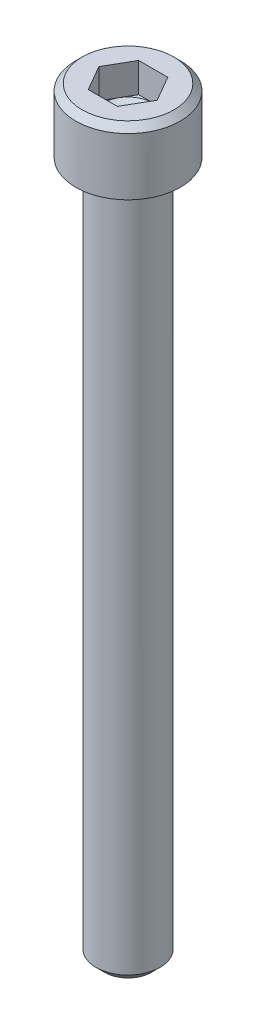
ISO-10303-21;
HEADER;
FILE_DESCRIPTION(('STEP AP214'),'2;1');
FILE_NAME('part.step','',(''),(''),'','','');
FILE_SCHEMA(('AUTOMOTIVE_DESIGN { 1 0 10303 214 1 1 1 1 }'));
ENDSEC;
DATA;
#1=APPLICATION_CONTEXT('core data for automotive mechanical design processes');
#2=APPLICATION_PROTOCOL_DEFINITION('international standard','automotive_design',2000,#1);
#3=PRODUCT_CONTEXT('',#1,'mechanical');
#4=PRODUCT('Part','Part','',(#3));
#5=PRODUCT_RELATED_PRODUCT_CATEGORY('part','',(#4));
#6=PRODUCT_DEFINITION_FORMATION('','',#4);
#7=PRODUCT_DEFINITION_CONTEXT('part definition',#1,'design');
#8=PRODUCT_DEFINITION('design','',#6,#7);
#9=PRODUCT_DEFINITION_SHAPE('','',#8);
#10=(LENGTH_UNIT() NAMED_UNIT(*) SI_UNIT(.MILLI.,.METRE.));
#11=(NAMED_UNIT(*) PLANE_ANGLE_UNIT() SI_UNIT($,.RADIAN.));
#12=(NAMED_UNIT(*) SI_UNIT($,.STERADIAN.) SOLID_ANGLE_UNIT());
#13=UNCERTAINTY_MEASURE_WITH_UNIT(LENGTH_MEASURE(1.E-05),#10,'distance_accuracy_value','');
#14=(GEOMETRIC_REPRESENTATION_CONTEXT(3) GLOBAL_UNCERTAINTY_ASSIGNED_CONTEXT((#13)) GLOBAL_UNIT_ASSIGNED_CONTEXT((#10,
#11,#12)) REPRESENTATION_CONTEXT('',''));
#15=CARTESIAN_POINT('',(0.,0.,0.));
#16=DIRECTION('',(0.,0.,1.));
#17=DIRECTION('',(1.,0.,0.));
#18=AXIS2_PLACEMENT_3D('',#15,#16,#17);
#19=CARTESIAN_POINT('',(0.,1.8796,0.));
#20=DIRECTION('',(0.,1.,0.));
#21=DIRECTION('',(0.,0.,1.));
#22=AXIS2_PLACEMENT_3D('',#19,#20,#21);
#23=PLANE('',#22);
#24=DIRECTION('',(-1.,0.,0.));
#25=VECTOR('',#24,1.);
#26=CARTESIAN_POINT('',(0.799225977638982,1.8796,-1.38429999999987));
#27=LINE('',#26,#25);
#28=CARTESIAN_POINT('',(0.799225977638982,1.8796,-1.38429999999987));
#29=VERTEX_POINT('',#28);
#30=CARTESIAN_POINT('',(0.,1.87959999999497,-1.38429999999987));
#31=VERTEX_POINT('',#30);
#32=EDGE_CURVE('E160',#29,#31,#27,.T.);
#33=ORIENTED_EDGE('',*,*,#32,.T.);
#34=CARTESIAN_POINT('',(0.,1.87959999999497,0.));
#35=DIRECTION('',(0.,-1.,0.));
#36=DIRECTION('',(0.,0.,-1.));
#37=AXIS2_PLACEMENT_3D('',#34,#35,#36);
#38=CIRCLE('',#37,1.38430000004078);
#39=CARTESIAN_POINT('',(1.19883896649411,1.87959999999497,-0.692150000020388));
#40=VERTEX_POINT('',#39);
#41=EDGE_CURVE('E48',#31,#40,#38,.T.);
#42=ORIENTED_EDGE('',*,*,#41,.T.);
#43=DIRECTION('',(-0.5,0.,-0.866025403784439));
#44=VECTOR('',#43,1.);
#45=CARTESIAN_POINT('',(1.59845195527816,1.8796,0.));
#46=LINE('',#45,#44);
#47=EDGE_CURVE('E287',#40,#29,#46,.T.);
#48=ORIENTED_EDGE('',*,*,#47,.T.);
#49=EDGE_LOOP('',(#33,#42,#48));
#50=FACE_BOUND('',#49,.T.);
#51=ADVANCED_FACE('F33',(#50),#23,.T.);
#52=CARTESIAN_POINT('',(1.59845195527816,1.8796,0.));
#53=VERTEX_POINT('',#52);
#54=EDGE_CURVE('E288',#53,#40,#46,.T.);
#55=ORIENTED_EDGE('',*,*,#54,.T.);
#56=CARTESIAN_POINT('',(1.19883896649411,1.87959999999497,0.692150000020388));
#57=VERTEX_POINT('',#56);
#58=EDGE_CURVE('E201',#40,#57,#38,.T.);
#59=ORIENTED_EDGE('',*,*,#58,.T.);
#60=DIRECTION('',(0.5,0.,-0.866025403784439));
#61=VECTOR('',#60,1.);
#62=CARTESIAN_POINT('',(0.799225977639064,1.8796,1.38429999999992));
#63=LINE('',#62,#61);
#64=EDGE_CURVE('E284',#57,#53,#63,.T.);
#65=ORIENTED_EDGE('',*,*,#64,.T.);
#66=EDGE_LOOP('',(#55,#59,#65));
#67=FACE_BOUND('',#66,.T.);
#68=ADVANCED_FACE('F123',(#67),#23,.T.);
#69=CARTESIAN_POINT('',(0.799225977639064,1.8796,1.38429999999992));
#70=VERTEX_POINT('',#69);
#71=EDGE_CURVE('E274',#70,#57,#63,.T.);
#72=ORIENTED_EDGE('',*,*,#71,.T.);
#73=CARTESIAN_POINT('',(0.,1.87959999999497,1.38430000004078));
#74=VERTEX_POINT('',#73);
#75=EDGE_CURVE('E296',#57,#74,#38,.T.);
#76=ORIENTED_EDGE('',*,*,#75,.T.);
#77=DIRECTION('',(1.,0.,0.));
#78=VECTOR('',#77,1.);
#79=CARTESIAN_POINT('',(-0.799225977639255,1.8796,1.38429999999992));
#80=LINE('',#79,#78);
#81=EDGE_CURVE('E182',#74,#70,#80,.T.);
#82=ORIENTED_EDGE('',*,*,#81,.T.);
#83=EDGE_LOOP('',(#72,#76,#82));
#84=FACE_BOUND('',#83,.T.);
#85=ADVANCED_FACE('F129',(#84),#23,.T.);
#86=CARTESIAN_POINT('',(-0.799225977639255,1.8796,1.38429999999992));
#87=VERTEX_POINT('',#86);
#88=EDGE_CURVE('E277',#87,#74,#80,.T.);
#89=ORIENTED_EDGE('',*,*,#88,.T.);
#90=CARTESIAN_POINT('',(-1.19883896649414,1.87959999999497,0.692150000020335));
#91=VERTEX_POINT('',#90);
#92=EDGE_CURVE('E283',#74,#91,#38,.T.);
#93=ORIENTED_EDGE('',*,*,#92,.T.);
#94=DIRECTION('',(0.499999999999962,0.,0.866025403784461));
#95=VECTOR('',#94,1.);
#96=CARTESIAN_POINT('',(-1.59845195527835,1.8796,0.));
#97=LINE('',#96,#95);
#98=EDGE_CURVE('E155',#91,#87,#97,.T.);
#99=ORIENTED_EDGE('',*,*,#98,.T.);
#100=EDGE_LOOP('',(#89,#93,#99));
#101=FACE_BOUND('',#100,.T.);
#102=ADVANCED_FACE('F144',(#101),#23,.T.);
#103=CARTESIAN_POINT('',(-1.59845195527835,1.8796,0.));
#104=VERTEX_POINT('',#103);
#105=EDGE_CURVE('E158',#104,#91,#97,.T.);
#106=ORIENTED_EDGE('',*,*,#105,.T.);
#107=CARTESIAN_POINT('',(-1.19883896649411,1.87959999999497,-0.692150000020388));
#108=VERTEX_POINT('',#107);
#109=EDGE_CURVE('E295',#91,#108,#38,.T.);
#110=ORIENTED_EDGE('',*,*,#109,.T.);
#111=DIRECTION('',(-0.5,0.,0.866025403784439));
#112=VECTOR('',#111,1.);
#113=CARTESIAN_POINT('',(-0.799225977639255,1.8796,-1.38429999999987));
#114=LINE('',#113,#112);
#115=EDGE_CURVE('E156',#108,#104,#114,.T.);
#116=ORIENTED_EDGE('',*,*,#115,.T.);
#117=EDGE_LOOP('',(#106,#110,#116));
#118=FACE_BOUND('',#117,.T.);
#119=ADVANCED_FACE('F135',(#118),#23,.T.);
#120=CARTESIAN_POINT('',(-0.799225977639255,1.8796,-1.38429999999987));
#121=VERTEX_POINT('',#120);
#122=EDGE_CURVE('E148',#121,#108,#114,.T.);
#123=ORIENTED_EDGE('',*,*,#122,.T.);
#124=EDGE_CURVE('E149',#108,#31,#38,.T.);
#125=ORIENTED_EDGE('',*,*,#124,.T.);
#126=EDGE_CURVE('E151',#31,#121,#27,.T.);
#127=ORIENTED_EDGE('',*,*,#126,.T.);
#128=EDGE_LOOP('',(#123,#125,#127));
#129=FACE_BOUND('',#128,.T.);
#130=ADVANCED_FACE('F125',(#129),#23,.T.);
#131=CARTESIAN_POINT('',(0.,0.,0.));
#132=DIRECTION('',(0.,-1.,0.));
#133=DIRECTION('',(0.,0.,-1.));
#134=AXIS2_PLACEMENT_3D('',#131,#132,#133);
#135=PLANE('',#134);
#136=CARTESIAN_POINT('',(0.,0.,0.));
#137=DIRECTION('',(0.,-1.,0.));
#138=DIRECTION('',(0.,0.,-1.));
#139=AXIS2_PLACEMENT_3D('',#136,#137,#138);
#140=CIRCLE('',#139,2.0066);
#141=CARTESIAN_POINT('',(0.,0.,-2.0066));
#142=VERTEX_POINT('',#141);
#143=EDGE_CURVE('E11',#142,#142,#140,.F.);
#144=ORIENTED_EDGE('',*,*,#143,.T.);
#145=EDGE_LOOP('',(#144));
#146=FACE_BOUND('',#145,.T.);
#147=CARTESIAN_POINT('',(0.,0.,0.));
#148=DIRECTION('',(0.,-1.,0.));
#149=DIRECTION('',(0.,0.,-1.));
#150=AXIS2_PLACEMENT_3D('',#147,#148,#149);
#151=CIRCLE('',#150,2.8702);
#152=CARTESIAN_POINT('',(0.,0.,-2.8702));
#153=VERTEX_POINT('',#152);
#154=EDGE_CURVE('E185',#153,#153,#151,.T.);
#155=ORIENTED_EDGE('',*,*,#154,.T.);
#156=EDGE_LOOP('',(#155));
#157=FACE_BOUND('',#156,.T.);
#158=ADVANCED_FACE('F134',(#146,#157),#135,.T.);
#159=CARTESIAN_POINT('',(0.,3.5052,0.));
#160=DIRECTION('',(0.,-1.,0.));
#161=DIRECTION('',(0.,0.,-1.));
#162=AXIS2_PLACEMENT_3D('',#159,#160,#161);
#163=CYLINDRICAL_SURFACE('',#162,2.8702);
#164=CARTESIAN_POINT('',(0.,3.14960000004543,0.));
#165=DIRECTION('',(0.,1.,0.));
#166=DIRECTION('',(0.,0.,1.));
#167=AXIS2_PLACEMENT_3D('',#164,#165,#166);
#168=CIRCLE('',#167,2.8702);
#169=CARTESIAN_POINT('',(0.,3.14960000004543,2.8702));
#170=VERTEX_POINT('',#169);
#171=EDGE_CURVE('E204',#170,#170,#168,.F.);
#172=ORIENTED_EDGE('',*,*,#171,.T.);
#173=EDGE_LOOP('',(#172));
#174=FACE_BOUND('',#173,.T.);
#175=ORIENTED_EDGE('',*,*,#154,.F.);
#176=EDGE_LOOP('',(#175));
#177=FACE_BOUND('',#176,.T.);
#178=ADVANCED_FACE('F141',(#174,#177),#163,.T.);
#179=CARTESIAN_POINT('',(2.8702,3.5052,0.));
#180=DIRECTION('',(0.,1.,0.));
#181=DIRECTION('',(0.,0.,1.));
#182=AXIS2_PLACEMENT_3D('',#179,#180,#181);
#183=PLANE('',#182);
#184=CARTESIAN_POINT('',(0.,3.5052,0.));
#185=DIRECTION('',(0.,1.,0.));
#186=DIRECTION('',(0.,0.,1.));
#187=AXIS2_PLACEMENT_3D('',#184,#185,#186);
#188=CIRCLE('',#187,2.51459999998859);
#189=CARTESIAN_POINT('',(0.,3.5052,2.51459999998859));
#190=VERTEX_POINT('',#189);
#191=EDGE_CURVE('E207',#190,#190,#188,.T.);
#192=ORIENTED_EDGE('',*,*,#191,.T.);
#193=EDGE_LOOP('',(#192));
#194=FACE_BOUND('',#193,.T.);
#195=DIRECTION('',(1.,0.,0.));
#196=VECTOR('',#195,1.);
#197=CARTESIAN_POINT('',(-0.799225977639255,3.5052,1.38429999999992));
#198=LINE('',#197,#196);
#199=CARTESIAN_POINT('',(-0.799225977639255,3.5052,1.38429999999992));
#200=VERTEX_POINT('',#199);
#201=CARTESIAN_POINT('',(0.799225977639064,3.5052,1.38429999999992));
#202=VERTEX_POINT('',#201);
#203=EDGE_CURVE('E56',#200,#202,#198,.T.);
#204=ORIENTED_EDGE('',*,*,#203,.F.);
#205=DIRECTION('',(0.499999999999962,0.,0.866025403784461));
#206=VECTOR('',#205,1.);
#207=CARTESIAN_POINT('',(-1.59845195527835,3.5052,0.));
#208=LINE('',#207,#206);
#209=CARTESIAN_POINT('',(-1.59845195527835,3.5052,0.));
#210=VERTEX_POINT('',#209);
#211=EDGE_CURVE('E179',#210,#200,#208,.T.);
#212=ORIENTED_EDGE('',*,*,#211,.F.);
#213=DIRECTION('',(-0.5,0.,0.866025403784439));
#214=VECTOR('',#213,1.);
#215=CARTESIAN_POINT('',(-0.799225977639255,3.5052,-1.38429999999987));
#216=LINE('',#215,#214);
#217=CARTESIAN_POINT('',(-0.799225977639255,3.5052,-1.38429999999987));
#218=VERTEX_POINT('',#217);
#219=EDGE_CURVE('E176',#218,#210,#216,.T.);
#220=ORIENTED_EDGE('',*,*,#219,.F.);
#221=DIRECTION('',(-1.,0.,0.));
#222=VECTOR('',#221,1.);
#223=CARTESIAN_POINT('',(0.799225977638982,3.5052,-1.38429999999987));
#224=LINE('',#223,#222);
#225=CARTESIAN_POINT('',(0.799225977638982,3.5052,-1.38429999999987));
#226=VERTEX_POINT('',#225);
#227=EDGE_CURVE('E173',#226,#218,#224,.T.);
#228=ORIENTED_EDGE('',*,*,#227,.F.);
#229=DIRECTION('',(-0.5,0.,-0.866025403784439));
#230=VECTOR('',#229,1.);
#231=CARTESIAN_POINT('',(1.59845195527816,3.5052,0.));
#232=LINE('',#231,#230);
#233=CARTESIAN_POINT('',(1.59845195527816,3.5052,0.));
#234=VERTEX_POINT('',#233);
#235=EDGE_CURVE('E170',#234,#226,#232,.T.);
#236=ORIENTED_EDGE('',*,*,#235,.F.);
#237=DIRECTION('',(0.5,0.,-0.866025403784439));
#238=VECTOR('',#237,1.);
#239=CARTESIAN_POINT('',(0.799225977639064,3.5052,1.38429999999992));
#240=LINE('',#239,#238);
#241=EDGE_CURVE('E167',#202,#234,#240,.T.);
#242=ORIENTED_EDGE('',*,*,#241,.F.);
#243=EDGE_LOOP('',(#204,#212,#220,#228,#236,#242));
#244=FACE_BOUND('',#243,.T.);
#245=ADVANCED_FACE('F226',(#194,#244),#183,.T.);
#246=CARTESIAN_POINT('',(0.,-38.1,0.));
#247=DIRECTION('',(0.,1.,0.));
#248=DIRECTION('',(0.,0.,1.));
#249=AXIS2_PLACEMENT_3D('',#246,#247,#248);
#250=CYLINDRICAL_SURFACE('',#249,1.7526);
#251=CARTESIAN_POINT('',(0.,-0.253999999999997,0.));
#252=DIRECTION('',(0.,-1.,0.));
#253=DIRECTION('',(0.,0.,-1.));
#254=AXIS2_PLACEMENT_3D('',#251,#252,#253);
#255=CIRCLE('',#254,1.7526);
#256=CARTESIAN_POINT('',(0.,-0.25399999999999,1.7526));
#257=VERTEX_POINT('',#256);
#258=EDGE_CURVE('E41',#257,#257,#255,.T.);
#259=CARTESIAN_POINT('',(0.,-37.6275599999883,0.));
#260=DIRECTION('',(0.,-1.,0.));
#261=DIRECTION('',(0.,0.,-1.));
#262=AXIS2_PLACEMENT_3D('',#259,#260,#261);
#263=CIRCLE('',#262,1.7526);
#264=CARTESIAN_POINT('',(0.,-37.6275599999883,1.7526));
#265=VERTEX_POINT('',#264);
#266=EDGE_CURVE('E200',#265,#265,#263,.F.);
#267=CARTESIAN_POINT('',(0.,-0.25399999999999,1.7526));
#268=CARTESIAN_POINT('',(0.,-0.643307916666535,1.7526));
#269=CARTESIAN_POINT('',(0.,-1.03261583333308,1.7526));
#270=CARTESIAN_POINT('',(0.,-1.81123166666617,1.7526));
#271=CARTESIAN_POINT('',(0.,-2.20053958333271,1.7526));
#272=CARTESIAN_POINT('',(0.,-2.9791554166658,1.7526));
#273=CARTESIAN_POINT('',(0.,-3.36846333333235,1.7526));
#274=CARTESIAN_POINT('',(0.,-4.14707916666544,1.7526));
#275=CARTESIAN_POINT('',(0.,-4.53638708333199,1.7526));
#276=CARTESIAN_POINT('',(0.,-5.31500291666507,1.7526));
#277=CARTESIAN_POINT('',(0.,-5.70431083333162,1.7526));
#278=CARTESIAN_POINT('',(0.,-6.48292666666471,1.7526));
#279=CARTESIAN_POINT('',(0.,-6.87223458333125,1.7526));
#280=CARTESIAN_POINT('',(0.,-7.65085041666434,1.7526));
#281=CARTESIAN_POINT('',(0.,-8.04015833333089,1.7526));
#282=CARTESIAN_POINT('',(0.,-8.81877416666398,1.7526));
#283=CARTESIAN_POINT('',(0.,-9.20808208333052,1.7526));
#284=CARTESIAN_POINT('',(0.,-9.98669791666361,1.7526));
#285=CARTESIAN_POINT('',(0.,-10.3760058333302,1.7526));
#286=CARTESIAN_POINT('',(0.,-11.1546216666632,1.7526));
#287=CARTESIAN_POINT('',(0.,-11.5439295833298,1.7526));
#288=CARTESIAN_POINT('',(0.,-12.3225454166629,1.7526));
#289=CARTESIAN_POINT('',(0.,-12.7118533333294,1.7526));
#290=CARTESIAN_POINT('',(0.,-13.4904691666625,1.7526));
#291=CARTESIAN_POINT('',(0.,-13.8797770833291,1.7526));
#292=CARTESIAN_POINT('',(0.,-14.6583929166621,1.7526));
#293=CARTESIAN_POINT('',(0.,-15.0477008333287,1.7526));
#294=CARTESIAN_POINT('',(0.,-15.8263166666618,1.7526));
#295=CARTESIAN_POINT('',(0.,-16.2156245833283,1.7526));
#296=CARTESIAN_POINT('',(0.,-16.9942404166614,1.7526));
#297=CARTESIAN_POINT('',(0.,-17.383548333328,1.7526));
#298=CARTESIAN_POINT('',(0.,-18.1621641666611,1.7526));
#299=CARTESIAN_POINT('',(0.,-18.5514720833276,1.7526));
#300=CARTESIAN_POINT('',(0.,-19.3300879166607,1.7526));
#301=CARTESIAN_POINT('',(0.,-19.7193958333272,1.7526));
#302=CARTESIAN_POINT('',(0.,-20.4980116666603,1.7526));
#303=CARTESIAN_POINT('',(0.,-20.8873195833269,1.7526));
#304=CARTESIAN_POINT('',(0.,-21.66593541666,1.7526));
#305=CARTESIAN_POINT('',(0.,-22.0552433333265,1.7526));
#306=CARTESIAN_POINT('',(0.,-22.8338591666596,1.7526));
#307=CARTESIAN_POINT('',(0.,-23.2231670833261,1.7526));
#308=CARTESIAN_POINT('',(0.,-24.0017829166592,1.7526));
#309=CARTESIAN_POINT('',(0.,-24.3910908333258,1.7526));
#310=CARTESIAN_POINT('',(0.,-25.1697066666589,1.7526));
#311=CARTESIAN_POINT('',(0.,-25.5590145833254,1.7526));
#312=CARTESIAN_POINT('',(0.,-26.3376304166585,1.7526));
#313=CARTESIAN_POINT('',(0.,-26.726938333325,1.7526));
#314=CARTESIAN_POINT('',(0.,-27.5055541666581,1.7526));
#315=CARTESIAN_POINT('',(0.,-27.8948620833247,1.7526));
#316=CARTESIAN_POINT('',(0.,-28.6734779166578,1.7526));
#317=CARTESIAN_POINT('',(0.,-29.0627858333243,1.7526));
#318=CARTESIAN_POINT('',(0.,-29.8414016666574,1.7526));
#319=CARTESIAN_POINT('',(0.,-30.2307095833239,1.7526));
#320=CARTESIAN_POINT('',(0.,-31.009325416657,1.7526));
#321=CARTESIAN_POINT('',(0.,-31.3986333333236,1.7526));
#322=CARTESIAN_POINT('',(0.,-32.1772491666567,1.7526));
#323=CARTESIAN_POINT('',(0.,-32.5665570833232,1.7526));
#324=CARTESIAN_POINT('',(0.,-33.3451729166563,1.7526));
#325=CARTESIAN_POINT('',(0.,-33.7344808333228,1.7526));
#326=CARTESIAN_POINT('',(0.,-34.5130966666559,1.7526));
#327=CARTESIAN_POINT('',(0.,-34.9024045833225,1.7526));
#328=CARTESIAN_POINT('',(0.,-35.6810204166556,1.7526));
#329=CARTESIAN_POINT('',(0.,-36.0703283333221,1.7526));
#330=CARTESIAN_POINT('',(0.,-36.8489441666552,1.7526));
#331=CARTESIAN_POINT('',(0.,-37.2382520833218,1.7526));
#332=CARTESIAN_POINT('',(0.,-37.6275599999883,1.7526));
#333=B_SPLINE_CURVE_WITH_KNOTS('',3,(#267,#268,#269,#270,#271,#272,#273,#274,#275,#276,#277,
#278,#279,#280,#281,#282,#283,#284,#285,#286,#287,#288,#289,#290,#291,#292,#293,#294,#295,#296,
#297,#298,#299,#300,#301,#302,#303,#304,#305,#306,#307,#308,#309,#310,#311,#312,#313,#314,#315,
#316,#317,#318,#319,#320,#321,#322,#323,#324,#325,#326,#327,#328,#329,#330,#331,#332),
.UNSPECIFIED.,.F.,.F.,(4,2,2,2,2,2,2,2,2,2,2,2,2,2,2,2,2,2,2,2,2,2,2,2,2,2,2,2,2,2,2,2,4),(0.,
1.16792374999963,2.33584749999927,3.50377124999891,4.67169499999854,5.83961874999817,
7.00754249999781,8.17546624999744,9.34338999999708,10.5113137499967,11.6792374999963,
12.847161249996,14.0150849999956,15.1830087499952,16.3509324999949,17.5188562499945,
18.6867799999942,19.8547037499938,21.0226274999934,22.1905512499931,23.3584749999927,
24.5263987499923,25.694322499992,26.8622462499916,28.0301699999912,29.1980937499909,
30.3660174999905,31.5339412499901,32.7018649999898,33.8697887499894,35.037712499989,
36.2056362499887,37.3735599999883),.UNSPECIFIED.);
#334=EDGE_CURVE('BSEAM212',#257,#265,#333,.T.);
#335=ORIENTED_EDGE('',*,*,#258,.T.);
#336=ORIENTED_EDGE('',*,*,#266,.T.);
#337=ORIENTED_EDGE('',*,*,#334,.T.);
#338=ORIENTED_EDGE('',*,*,#334,.F.);
#339=EDGE_LOOP('',(#335,#337,#336,#338));
#340=FACE_BOUND('',#339,.T.);
#341=ADVANCED_FACE('F212',(#340),#250,.T.);
#342=CARTESIAN_POINT('',(0.,-38.1,0.));
#343=DIRECTION('',(0.,-1.,0.));
#344=DIRECTION('',(0.,0.,-1.));
#345=AXIS2_PLACEMENT_3D('',#342,#343,#344);
#346=PLANE('',#345);
#347=CARTESIAN_POINT('',(0.,-38.1,0.));
#348=DIRECTION('',(0.,-1.,0.));
#349=DIRECTION('',(0.,0.,-1.));
#350=AXIS2_PLACEMENT_3D('',#347,#348,#349);
#351=CIRCLE('',#350,1.28015999998832);
#352=CARTESIAN_POINT('',(0.,-38.1,-1.28015999998832));
#353=VERTEX_POINT('',#352);
#354=EDGE_CURVE('E197',#353,#353,#351,.T.);
#355=ORIENTED_EDGE('',*,*,#354,.T.);
#356=EDGE_LOOP('',(#355));
#357=FACE_BOUND('',#356,.T.);
#358=ADVANCED_FACE('F237',(#357),#346,.T.);
#359=CARTESIAN_POINT('',(-0.799225977639255,1.8796,1.38429999999992));
#360=DIRECTION('',(0.,0.,1.));
#361=DIRECTION('',(1.,0.,0.));
#362=AXIS2_PLACEMENT_3D('',#359,#360,#361);
#363=PLANE('',#362);
#364=ORIENTED_EDGE('',*,*,#203,.T.);
#365=DIRECTION('',(0.,1.,0.));
#366=VECTOR('',#365,1.);
#367=CARTESIAN_POINT('',(0.799225977639064,1.8796,1.38429999999992));
#368=LINE('',#367,#366);
#369=EDGE_CURVE('E165',#70,#202,#368,.T.);
#370=ORIENTED_EDGE('',*,*,#369,.F.);
#371=ORIENTED_EDGE('',*,*,#81,.F.);
#372=ORIENTED_EDGE('',*,*,#88,.F.);
#373=DIRECTION('',(0.,1.,0.));
#374=VECTOR('',#373,1.);
#375=CARTESIAN_POINT('',(-0.799225977639255,1.8796,1.38429999999992));
#376=LINE('',#375,#374);
#377=EDGE_CURVE('E183',#87,#200,#376,.T.);
#378=ORIENTED_EDGE('',*,*,#377,.T.);
#379=EDGE_LOOP('',(#364,#370,#371,#372,#378));
#380=FACE_BOUND('',#379,.T.);
#381=ADVANCED_FACE('F240',(#380),#363,.F.);
#382=CARTESIAN_POINT('',(-1.59845195527835,1.8796,0.));
#383=DIRECTION('',(-0.866025403784461,0.,0.499999999999962));
#384=DIRECTION('',(0.499999999999962,0.,0.866025403784461));
#385=AXIS2_PLACEMENT_3D('',#382,#383,#384);
#386=PLANE('',#385);
#387=ORIENTED_EDGE('',*,*,#211,.T.);
#388=ORIENTED_EDGE('',*,*,#377,.F.);
#389=ORIENTED_EDGE('',*,*,#98,.F.);
#390=ORIENTED_EDGE('',*,*,#105,.F.);
#391=DIRECTION('',(0.,1.,0.));
#392=VECTOR('',#391,1.);
#393=CARTESIAN_POINT('',(-1.59845195527835,1.8796,0.));
#394=LINE('',#393,#392);
#395=EDGE_CURVE('E186',#104,#210,#394,.T.);
#396=ORIENTED_EDGE('',*,*,#395,.T.);
#397=EDGE_LOOP('',(#387,#388,#389,#390,#396));
#398=FACE_BOUND('',#397,.T.);
#399=ADVANCED_FACE('F243',(#398),#386,.F.);
#400=CARTESIAN_POINT('',(-0.799225977639255,1.8796,-1.38429999999987));
#401=DIRECTION('',(-0.866025403784439,0.,-0.5));
#402=DIRECTION('',(-0.5,0.,0.866025403784439));
#403=AXIS2_PLACEMENT_3D('',#400,#401,#402);
#404=PLANE('',#403);
#405=ORIENTED_EDGE('',*,*,#219,.T.);
#406=ORIENTED_EDGE('',*,*,#395,.F.);
#407=ORIENTED_EDGE('',*,*,#115,.F.);
#408=ORIENTED_EDGE('',*,*,#122,.F.);
#409=DIRECTION('',(0.,1.,0.));
#410=VECTOR('',#409,1.);
#411=CARTESIAN_POINT('',(-0.799225977639255,1.8796,-1.38429999999987));
#412=LINE('',#411,#410);
#413=EDGE_CURVE('E188',#121,#218,#412,.T.);
#414=ORIENTED_EDGE('',*,*,#413,.T.);
#415=EDGE_LOOP('',(#405,#406,#407,#408,#414));
#416=FACE_BOUND('',#415,.T.);
#417=ADVANCED_FACE('F251',(#416),#404,.F.);
#418=CARTESIAN_POINT('',(0.799225977638982,1.8796,-1.38429999999987));
#419=DIRECTION('',(0.,0.,-1.));
#420=DIRECTION('',(-1.,0.,0.));
#421=AXIS2_PLACEMENT_3D('',#418,#419,#420);
#422=PLANE('',#421);
#423=ORIENTED_EDGE('',*,*,#227,.T.);
#424=ORIENTED_EDGE('',*,*,#413,.F.);
#425=ORIENTED_EDGE('',*,*,#126,.F.);
#426=ORIENTED_EDGE('',*,*,#32,.F.);
#427=DIRECTION('',(0.,1.,0.));
#428=VECTOR('',#427,1.);
#429=CARTESIAN_POINT('',(0.799225977638982,1.8796,-1.38429999999987));
#430=LINE('',#429,#428);
#431=EDGE_CURVE('E190',#29,#226,#430,.T.);
#432=ORIENTED_EDGE('',*,*,#431,.T.);
#433=EDGE_LOOP('',(#423,#424,#425,#426,#432));
#434=FACE_BOUND('',#433,.T.);
#435=ADVANCED_FACE('F247',(#434),#422,.F.);
#436=CARTESIAN_POINT('',(1.59845195527816,1.8796,0.));
#437=DIRECTION('',(0.866025403784439,0.,-0.5));
#438=DIRECTION('',(-0.5,0.,-0.866025403784439));
#439=AXIS2_PLACEMENT_3D('',#436,#437,#438);
#440=PLANE('',#439);
#441=ORIENTED_EDGE('',*,*,#235,.T.);
#442=ORIENTED_EDGE('',*,*,#431,.F.);
#443=ORIENTED_EDGE('',*,*,#47,.F.);
#444=ORIENTED_EDGE('',*,*,#54,.F.);
#445=DIRECTION('',(0.,1.,0.));
#446=VECTOR('',#445,1.);
#447=CARTESIAN_POINT('',(1.59845195527816,1.8796,0.));
#448=LINE('',#447,#446);
#449=EDGE_CURVE('E192',#53,#234,#448,.T.);
#450=ORIENTED_EDGE('',*,*,#449,.T.);
#451=EDGE_LOOP('',(#441,#442,#443,#444,#450));
#452=FACE_BOUND('',#451,.T.);
#453=ADVANCED_FACE('F118',(#452),#440,.F.);
#454=CARTESIAN_POINT('',(0.799225977639064,1.8796,1.38429999999992));
#455=DIRECTION('',(0.866025403784439,0.,0.5));
#456=DIRECTION('',(0.5,0.,-0.866025403784439));
#457=AXIS2_PLACEMENT_3D('',#454,#455,#456);
#458=PLANE('',#457);
#459=ORIENTED_EDGE('',*,*,#241,.T.);
#460=ORIENTED_EDGE('',*,*,#449,.F.);
#461=ORIENTED_EDGE('',*,*,#64,.F.);
#462=ORIENTED_EDGE('',*,*,#71,.F.);
#463=ORIENTED_EDGE('',*,*,#369,.T.);
#464=EDGE_LOOP('',(#459,#460,#461,#462,#463));
#465=FACE_BOUND('',#464,.T.);
#466=ADVANCED_FACE('F109',(#465),#458,.F.);
#467=CARTESIAN_POINT('',(0.,1.08037402233223,0.));
#468=DIRECTION('',(0.,1.,0.));
#469=DIRECTION('',(0.,0.,1.));
#470=AXIS2_PLACEMENT_3D('',#467,#468,#469);
#471=CONICAL_SURFACE('',#470,0.,1.0471975511966);
#472=ORIENTED_EDGE('',*,*,#41,.F.);
#473=ORIENTED_EDGE('',*,*,#124,.F.);
#474=ORIENTED_EDGE('',*,*,#109,.F.);
#475=ORIENTED_EDGE('',*,*,#92,.F.);
#476=ORIENTED_EDGE('',*,*,#75,.F.);
#477=ORIENTED_EDGE('',*,*,#58,.F.);
#478=EDGE_LOOP('',(#472,#473,#474,#475,#476,#477));
#479=FACE_BOUND('',#478,.T.);
#480=CARTESIAN_POINT('',(0.,1.08037402233223,0.));
#481=VERTEX_POINT('',#480);
#482=VERTEX_LOOP('',#481);
#483=FACE_BOUND('',#482,.T.);
#484=ADVANCED_FACE('F106',(#479,#483),#471,.F.);
#485=CARTESIAN_POINT('',(0.,-38.1,0.));
#486=DIRECTION('',(0.,1.,0.));
#487=DIRECTION('',(0.,0.,1.));
#488=AXIS2_PLACEMENT_3D('',#485,#486,#487);
#489=CONICAL_SURFACE('',#488,1.28015999998832,0.785398163397434);
#490=ORIENTED_EDGE('',*,*,#266,.F.);
#491=EDGE_LOOP('',(#490));
#492=FACE_BOUND('',#491,.T.);
#493=ORIENTED_EDGE('',*,*,#354,.F.);
#494=EDGE_LOOP('',(#493));
#495=FACE_BOUND('',#494,.T.);
#496=ADVANCED_FACE('F108',(#492,#495),#489,.T.);
#497=CARTESIAN_POINT('',(0.,3.14960000004543,0.));
#498=DIRECTION('',(0.,-1.,0.));
#499=DIRECTION('',(0.,0.,-1.));
#500=AXIS2_PLACEMENT_3D('',#497,#498,#499);
#501=CONICAL_SURFACE('',#500,2.8702,0.785398163477374);
#502=ORIENTED_EDGE('',*,*,#191,.F.);
#503=EDGE_LOOP('',(#502));
#504=FACE_BOUND('',#503,.T.);
#505=ORIENTED_EDGE('',*,*,#171,.F.);
#506=EDGE_LOOP('',(#505));
#507=FACE_BOUND('',#506,.T.);
#508=ADVANCED_FACE('F115',(#504,#507),#501,.T.);
#509=CARTESIAN_POINT('',(0.,-0.253999999999997,0.));
#510=DIRECTION('',(0.,-1.,0.));
#511=DIRECTION('',(0.,0.,-1.));
#512=AXIS2_PLACEMENT_3D('',#509,#510,#511);
#513=TOROIDAL_SURFACE('',#512,2.0066,0.254);
#514=ORIENTED_EDGE('',*,*,#143,.F.);
#515=EDGE_LOOP('',(#514));
#516=FACE_BOUND('',#515,.T.);
#517=ORIENTED_EDGE('',*,*,#258,.F.);
#518=EDGE_LOOP('',(#517));
#519=FACE_BOUND('',#518,.T.);
#520=ADVANCED_FACE('F35',(#516,#519),#513,.F.);
#521=CLOSED_SHELL('',(#51,#68,#85,#102,#119,#130,#158,#178,#245,#341,#358,#381,#399,#417,#435,
#453,#466,#484,#496,#508,#520));
#522=MANIFOLD_SOLID_BREP('B2',#521);
#523=ADVANCED_BREP_SHAPE_REPRESENTATION('',(#18,#522),#14);
#524=SHAPE_DEFINITION_REPRESENTATION(#9,#523);
ENDSEC;
END-ISO-10303-21;
